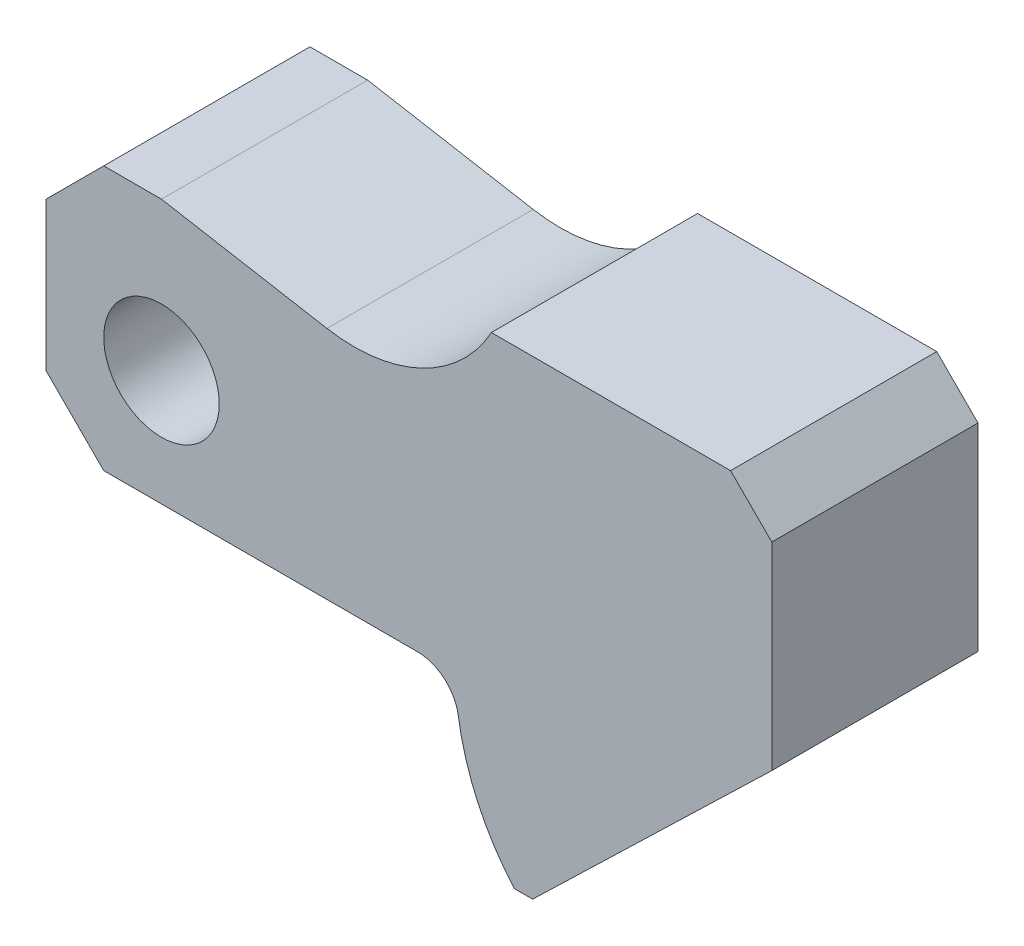
ISO-10303-21;
HEADER;
FILE_DESCRIPTION(('STEP AP214'),'2;1');
FILE_NAME('part.step','',(''),(''),'','','');
FILE_SCHEMA(('AUTOMOTIVE_DESIGN { 1 0 10303 214 1 1 1 1 }'));
ENDSEC;
DATA;
#1=APPLICATION_CONTEXT('core data for automotive mechanical design processes');
#2=APPLICATION_PROTOCOL_DEFINITION('international standard','automotive_design',2000,#1);
#3=PRODUCT_CONTEXT('',#1,'mechanical');
#4=PRODUCT('Part','Part','',(#3));
#5=PRODUCT_RELATED_PRODUCT_CATEGORY('part','',(#4));
#6=PRODUCT_DEFINITION_FORMATION('','',#4);
#7=PRODUCT_DEFINITION_CONTEXT('part definition',#1,'design');
#8=PRODUCT_DEFINITION('design','',#6,#7);
#9=PRODUCT_DEFINITION_SHAPE('','',#8);
#10=(LENGTH_UNIT() NAMED_UNIT(*) SI_UNIT(.MILLI.,.METRE.));
#11=(NAMED_UNIT(*) PLANE_ANGLE_UNIT() SI_UNIT($,.RADIAN.));
#12=(NAMED_UNIT(*) SI_UNIT($,.STERADIAN.) SOLID_ANGLE_UNIT());
#13=UNCERTAINTY_MEASURE_WITH_UNIT(LENGTH_MEASURE(1.E-05),#10,'distance_accuracy_value','');
#14=(GEOMETRIC_REPRESENTATION_CONTEXT(3) GLOBAL_UNCERTAINTY_ASSIGNED_CONTEXT((#13)) GLOBAL_UNIT_ASSIGNED_CONTEXT((#10,
#11,#12)) REPRESENTATION_CONTEXT('',''));
#15=CARTESIAN_POINT('',(0.,0.,0.));
#16=DIRECTION('',(0.,0.,1.));
#17=DIRECTION('',(1.,0.,0.));
#18=AXIS2_PLACEMENT_3D('',#15,#16,#17);
#19=CARTESIAN_POINT('',(0.,-10.,50.));
#20=DIRECTION('',(0.,0.,1.));
#21=DIRECTION('',(1.,0.,0.));
#22=AXIS2_PLACEMENT_3D('',#19,#20,#21);
#23=PLANE('',#22);
#24=CARTESIAN_POINT('',(0.,-10.,50.));
#25=DIRECTION('',(0.,0.,-1.));
#26=DIRECTION('',(1.,0.,0.));
#27=AXIS2_PLACEMENT_3D('',#24,#25,#26);
#28=CIRCLE('',#27,10.);
#29=CARTESIAN_POINT('',(0.,0.,50.));
#30=VERTEX_POINT('',#29);
#31=CARTESIAN_POINT('',(9.89127748282368,-8.52941176470592,50.));
#32=VERTEX_POINT('',#31);
#33=EDGE_CURVE('E199',#30,#32,#28,.T.);
#34=ORIENTED_EDGE('',*,*,#33,.T.);
#35=CARTESIAN_POINT('',(67.260686883201,0.,50.));
#36=DIRECTION('',(0.,0.,1.));
#37=DIRECTION('',(-1.,0.,0.));
#38=AXIS2_PLACEMENT_3D('',#35,#36,#37);
#39=CIRCLE('',#38,58.);
#40=CARTESIAN_POINT('',(23.4428822827877,-38.,50.));
#41=VERTEX_POINT('',#40);
#42=EDGE_CURVE('E117',#32,#41,#39,.T.);
#43=ORIENTED_EDGE('',*,*,#42,.T.);
#44=DIRECTION('',(1.,0.,0.));
#45=VECTOR('',#44,1.);
#46=CARTESIAN_POINT('',(27.9035440260581,-38.,50.));
#47=LINE('',#46,#45);
#48=CARTESIAN_POINT('',(27.9035440260581,-38.,50.));
#49=VERTEX_POINT('',#48);
#50=EDGE_CURVE('E232',#41,#49,#47,.T.);
#51=ORIENTED_EDGE('',*,*,#50,.T.);
#52=DIRECTION('',(0.719401460617409,0.694594513699567,0.));
#53=VECTOR('',#52,1.);
#54=CARTESIAN_POINT('',(85.9035440260581,18.,50.));
#55=LINE('',#54,#53);
#56=CARTESIAN_POINT('',(85.9035440260581,18.,50.));
#57=VERTEX_POINT('',#56);
#58=EDGE_CURVE('E251',#49,#57,#55,.T.);
#59=ORIENTED_EDGE('',*,*,#58,.T.);
#60=DIRECTION('',(0.,1.,0.));
#61=VECTOR('',#60,1.);
#62=CARTESIAN_POINT('',(85.9035440260581,66.,50.));
#63=LINE('',#62,#61);
#64=CARTESIAN_POINT('',(85.9035440260581,66.,50.));
#65=VERTEX_POINT('',#64);
#66=EDGE_CURVE('E248',#57,#65,#63,.T.);
#67=ORIENTED_EDGE('',*,*,#66,.T.);
#68=DIRECTION('',(-0.707106781186547,0.707106781186547,0.));
#69=VECTOR('',#68,1.);
#70=CARTESIAN_POINT('',(75.9035440260581,76.,50.));
#71=LINE('',#70,#69);
#72=CARTESIAN_POINT('',(75.9035440260581,76.,50.));
#73=VERTEX_POINT('',#72);
#74=EDGE_CURVE('E250',#65,#73,#71,.T.);
#75=ORIENTED_EDGE('',*,*,#74,.T.);
#76=DIRECTION('',(-1.,0.,0.));
#77=VECTOR('',#76,1.);
#78=CARTESIAN_POINT('',(17.9035440260581,76.,50.));
#79=LINE('',#78,#77);
#80=CARTESIAN_POINT('',(17.9035440260581,76.,50.));
#81=VERTEX_POINT('',#80);
#82=EDGE_CURVE('E253',#73,#81,#79,.T.);
#83=ORIENTED_EDGE('',*,*,#82,.T.);
#84=CARTESIAN_POINT('',(-15.3735066320414,94.3476946644064,50.));
#85=DIRECTION('',(0.,0.,-1.));
#86=DIRECTION('',(-1.,0.,0.));
#87=AXIS2_PLACEMENT_3D('',#84,#85,#86);
#88=CIRCLE('',#87,38.);
#89=CARTESIAN_POINT('',(-21.9721373833847,56.9250000499425,50.));
#90=VERTEX_POINT('',#89);
#91=EDGE_CURVE('E259',#81,#90,#88,.T.);
#92=ORIENTED_EDGE('',*,*,#91,.T.);
#93=DIRECTION('',(-0.984807753012208,0.173648177666931,0.));
#94=VECTOR('',#93,1.);
#95=CARTESIAN_POINT('',(-62.0964559739419,64.,50.));
#96=LINE('',#95,#94);
#97=CARTESIAN_POINT('',(-62.0964559739419,64.,50.));
#98=VERTEX_POINT('',#97);
#99=EDGE_CURVE('E261',#90,#98,#96,.T.);
#100=ORIENTED_EDGE('',*,*,#99,.T.);
#101=DIRECTION('',(-1.,0.,0.));
#102=VECTOR('',#101,1.);
#103=CARTESIAN_POINT('',(-76.0964559739419,64.,50.));
#104=LINE('',#103,#102);
#105=CARTESIAN_POINT('',(-76.0964559739419,64.,50.));
#106=VERTEX_POINT('',#105);
#107=EDGE_CURVE('E263',#98,#106,#104,.T.);
#108=ORIENTED_EDGE('',*,*,#107,.T.);
#109=DIRECTION('',(-0.707106781186549,-0.707106781186546,0.));
#110=VECTOR('',#109,1.);
#111=CARTESIAN_POINT('',(-90.0964559739419,50.,50.));
#112=LINE('',#111,#110);
#113=CARTESIAN_POINT('',(-90.0964559739419,50.,50.));
#114=VERTEX_POINT('',#113);
#115=EDGE_CURVE('E154',#106,#114,#112,.T.);
#116=ORIENTED_EDGE('',*,*,#115,.T.);
#117=DIRECTION('',(0.,-1.,0.));
#118=VECTOR('',#117,1.);
#119=CARTESIAN_POINT('',(-90.0964559739419,14.,50.));
#120=LINE('',#119,#118);
#121=CARTESIAN_POINT('',(-90.0964559739419,14.,50.));
#122=VERTEX_POINT('',#121);
#123=EDGE_CURVE('E148',#114,#122,#120,.T.);
#124=ORIENTED_EDGE('',*,*,#123,.T.);
#125=DIRECTION('',(0.707106781186549,-0.707106781186546,0.));
#126=VECTOR('',#125,1.);
#127=CARTESIAN_POINT('',(-76.0964559739419,0.,50.));
#128=LINE('',#127,#126);
#129=CARTESIAN_POINT('',(-76.0964559739419,0.,50.));
#130=VERTEX_POINT('',#129);
#131=EDGE_CURVE('E152',#122,#130,#128,.T.);
#132=ORIENTED_EDGE('',*,*,#131,.T.);
#133=DIRECTION('',(1.,0.,0.));
#134=VECTOR('',#133,1.);
#135=CARTESIAN_POINT('',(0.,0.,50.));
#136=LINE('',#135,#134);
#137=EDGE_CURVE('E56',#130,#30,#136,.T.);
#138=ORIENTED_EDGE('',*,*,#137,.T.);
#139=EDGE_LOOP('',(#34,#43,#51,#59,#67,#75,#83,#92,#100,#108,#116,#124,#132,#138));
#140=FACE_BOUND('',#139,.T.);
#141=CARTESIAN_POINT('',(-62.0964559739419,28.,50.));
#142=DIRECTION('',(0.,0.,1.));
#143=DIRECTION('',(1.,0.,0.));
#144=AXIS2_PLACEMENT_3D('',#141,#142,#143);
#145=CIRCLE('',#144,14.);
#146=CARTESIAN_POINT('',(-48.0964559739419,28.,50.));
#147=VERTEX_POINT('',#146);
#148=EDGE_CURVE('E176',#147,#147,#145,.T.);
#149=ORIENTED_EDGE('',*,*,#148,.F.);
#150=EDGE_LOOP('',(#149));
#151=FACE_BOUND('',#150,.T.);
#152=ADVANCED_FACE('F39',(#140,#151),#23,.T.);
#153=CARTESIAN_POINT('',(0.,-10.,0.));
#154=DIRECTION('',(0.,0.,1.));
#155=DIRECTION('',(1.,0.,0.));
#156=AXIS2_PLACEMENT_3D('',#153,#154,#155);
#157=PLANE('',#156);
#158=CARTESIAN_POINT('',(0.,-10.,0.));
#159=DIRECTION('',(0.,0.,-1.));
#160=DIRECTION('',(1.,0.,0.));
#161=AXIS2_PLACEMENT_3D('',#158,#159,#160);
#162=CIRCLE('',#161,10.);
#163=CARTESIAN_POINT('',(0.,0.,0.));
#164=VERTEX_POINT('',#163);
#165=CARTESIAN_POINT('',(9.89127748282368,-8.52941176470592,0.));
#166=VERTEX_POINT('',#165);
#167=EDGE_CURVE('E172',#164,#166,#162,.T.);
#168=ORIENTED_EDGE('',*,*,#167,.F.);
#169=DIRECTION('',(1.,0.,0.));
#170=VECTOR('',#169,1.);
#171=CARTESIAN_POINT('',(0.,0.,0.));
#172=LINE('',#171,#170);
#173=CARTESIAN_POINT('',(-76.0964559739419,0.,0.));
#174=VERTEX_POINT('',#173);
#175=EDGE_CURVE('E109',#174,#164,#172,.T.);
#176=ORIENTED_EDGE('',*,*,#175,.F.);
#177=DIRECTION('',(0.707106781186549,-0.707106781186546,0.));
#178=VECTOR('',#177,1.);
#179=CARTESIAN_POINT('',(-76.0964559739419,0.,0.));
#180=LINE('',#179,#178);
#181=CARTESIAN_POINT('',(-90.0964559739419,14.,0.));
#182=VERTEX_POINT('',#181);
#183=EDGE_CURVE('E103',#182,#174,#180,.T.);
#184=ORIENTED_EDGE('',*,*,#183,.F.);
#185=DIRECTION('',(0.,-1.,0.));
#186=VECTOR('',#185,1.);
#187=CARTESIAN_POINT('',(-90.0964559739419,14.,0.));
#188=LINE('',#187,#186);
#189=CARTESIAN_POINT('',(-90.0964559739419,50.,0.));
#190=VERTEX_POINT('',#189);
#191=EDGE_CURVE('E162',#190,#182,#188,.T.);
#192=ORIENTED_EDGE('',*,*,#191,.F.);
#193=DIRECTION('',(-0.707106781186549,-0.707106781186546,0.));
#194=VECTOR('',#193,1.);
#195=CARTESIAN_POINT('',(-90.0964559739419,50.,0.));
#196=LINE('',#195,#194);
#197=CARTESIAN_POINT('',(-76.0964559739419,64.,0.));
#198=VERTEX_POINT('',#197);
#199=EDGE_CURVE('E194',#198,#190,#196,.T.);
#200=ORIENTED_EDGE('',*,*,#199,.F.);
#201=DIRECTION('',(-1.,0.,0.));
#202=VECTOR('',#201,1.);
#203=CARTESIAN_POINT('',(-76.0964559739419,64.,0.));
#204=LINE('',#203,#202);
#205=CARTESIAN_POINT('',(-62.0964559739419,64.,0.));
#206=VERTEX_POINT('',#205);
#207=EDGE_CURVE('E192',#206,#198,#204,.T.);
#208=ORIENTED_EDGE('',*,*,#207,.F.);
#209=DIRECTION('',(-0.984807753012208,0.173648177666931,0.));
#210=VECTOR('',#209,1.);
#211=CARTESIAN_POINT('',(-62.0964559739419,64.,0.));
#212=LINE('',#211,#210);
#213=CARTESIAN_POINT('',(-21.9721373833847,56.9250000499425,0.));
#214=VERTEX_POINT('',#213);
#215=EDGE_CURVE('E190',#214,#206,#212,.T.);
#216=ORIENTED_EDGE('',*,*,#215,.F.);
#217=CARTESIAN_POINT('',(-15.3735066320414,94.3476946644064,0.));
#218=DIRECTION('',(0.,0.,-1.));
#219=DIRECTION('',(-1.,0.,0.));
#220=AXIS2_PLACEMENT_3D('',#217,#218,#219);
#221=CIRCLE('',#220,38.);
#222=CARTESIAN_POINT('',(17.9035440260581,76.,0.));
#223=VERTEX_POINT('',#222);
#224=EDGE_CURVE('E188',#223,#214,#221,.T.);
#225=ORIENTED_EDGE('',*,*,#224,.F.);
#226=DIRECTION('',(-1.,0.,0.));
#227=VECTOR('',#226,1.);
#228=CARTESIAN_POINT('',(17.9035440260581,76.,0.));
#229=LINE('',#228,#227);
#230=CARTESIAN_POINT('',(75.9035440260581,76.,0.));
#231=VERTEX_POINT('',#230);
#232=EDGE_CURVE('E186',#231,#223,#229,.T.);
#233=ORIENTED_EDGE('',*,*,#232,.F.);
#234=DIRECTION('',(-0.707106781186547,0.707106781186547,0.));
#235=VECTOR('',#234,1.);
#236=CARTESIAN_POINT('',(75.9035440260581,76.,0.));
#237=LINE('',#236,#235);
#238=CARTESIAN_POINT('',(85.9035440260581,66.,0.));
#239=VERTEX_POINT('',#238);
#240=EDGE_CURVE('E184',#239,#231,#237,.T.);
#241=ORIENTED_EDGE('',*,*,#240,.F.);
#242=DIRECTION('',(0.,1.,0.));
#243=VECTOR('',#242,1.);
#244=CARTESIAN_POINT('',(85.9035440260581,66.,0.));
#245=LINE('',#244,#243);
#246=CARTESIAN_POINT('',(85.9035440260581,18.,0.));
#247=VERTEX_POINT('',#246);
#248=EDGE_CURVE('E182',#247,#239,#245,.T.);
#249=ORIENTED_EDGE('',*,*,#248,.F.);
#250=DIRECTION('',(0.719401460617409,0.694594513699567,0.));
#251=VECTOR('',#250,1.);
#252=CARTESIAN_POINT('',(85.9035440260581,18.,0.));
#253=LINE('',#252,#251);
#254=CARTESIAN_POINT('',(27.9035440260581,-38.,0.));
#255=VERTEX_POINT('',#254);
#256=EDGE_CURVE('E180',#255,#247,#253,.T.);
#257=ORIENTED_EDGE('',*,*,#256,.F.);
#258=DIRECTION('',(1.,0.,0.));
#259=VECTOR('',#258,1.);
#260=CARTESIAN_POINT('',(27.9035440260581,-38.,0.));
#261=LINE('',#260,#259);
#262=CARTESIAN_POINT('',(23.4428822827877,-38.,0.));
#263=VERTEX_POINT('',#262);
#264=EDGE_CURVE('E178',#263,#255,#261,.T.);
#265=ORIENTED_EDGE('',*,*,#264,.F.);
#266=CARTESIAN_POINT('',(67.260686883201,0.,0.));
#267=DIRECTION('',(0.,0.,1.));
#268=DIRECTION('',(-1.,0.,0.));
#269=AXIS2_PLACEMENT_3D('',#266,#267,#268);
#270=CIRCLE('',#269,58.);
#271=EDGE_CURVE('E175',#166,#263,#270,.T.);
#272=ORIENTED_EDGE('',*,*,#271,.F.);
#273=EDGE_LOOP('',(#168,#176,#184,#192,#200,#208,#216,#225,#233,#241,#249,#257,#265,#272));
#274=FACE_BOUND('',#273,.T.);
#275=CARTESIAN_POINT('',(-62.0964559739419,28.,0.));
#276=DIRECTION('',(0.,0.,1.));
#277=DIRECTION('',(1.,0.,0.));
#278=AXIS2_PLACEMENT_3D('',#275,#276,#277);
#279=CIRCLE('',#278,14.);
#280=CARTESIAN_POINT('',(-48.0964559739419,28.,0.));
#281=VERTEX_POINT('',#280);
#282=EDGE_CURVE('E436',#281,#281,#279,.T.);
#283=ORIENTED_EDGE('',*,*,#282,.T.);
#284=EDGE_LOOP('',(#283));
#285=FACE_BOUND('',#284,.T.);
#286=ADVANCED_FACE('F236',(#274,#285),#157,.F.);
#287=CARTESIAN_POINT('',(0.,-10.,50.));
#288=DIRECTION('',(0.,0.,-1.));
#289=DIRECTION('',(-1.,0.,0.));
#290=AXIS2_PLACEMENT_3D('',#287,#288,#289);
#291=CYLINDRICAL_SURFACE('',#290,10.);
#292=ORIENTED_EDGE('',*,*,#167,.T.);
#293=DIRECTION('',(0.,0.,-1.));
#294=VECTOR('',#293,1.);
#295=CARTESIAN_POINT('',(9.89127748282368,-8.52941176470592,50.));
#296=LINE('',#295,#294);
#297=EDGE_CURVE('E11',#32,#166,#296,.T.);
#298=ORIENTED_EDGE('',*,*,#297,.F.);
#299=ORIENTED_EDGE('',*,*,#33,.F.);
#300=DIRECTION('',(0.,0.,-1.));
#301=VECTOR('',#300,1.);
#302=CARTESIAN_POINT('',(0.,0.,50.));
#303=LINE('',#302,#301);
#304=EDGE_CURVE('E168',#30,#164,#303,.T.);
#305=ORIENTED_EDGE('',*,*,#304,.T.);
#306=EDGE_LOOP('',(#292,#298,#299,#305));
#307=FACE_BOUND('',#306,.T.);
#308=ADVANCED_FACE('F41',(#307),#291,.F.);
#309=CARTESIAN_POINT('',(67.260686883201,0.,50.));
#310=DIRECTION('',(0.,0.,-1.));
#311=DIRECTION('',(-1.,0.,0.));
#312=AXIS2_PLACEMENT_3D('',#309,#310,#311);
#313=CYLINDRICAL_SURFACE('',#312,58.);
#314=ORIENTED_EDGE('',*,*,#271,.T.);
#315=DIRECTION('',(0.,0.,-1.));
#316=VECTOR('',#315,1.);
#317=CARTESIAN_POINT('',(23.4428822827877,-38.,50.));
#318=LINE('',#317,#316);
#319=EDGE_CURVE('E48',#41,#263,#318,.T.);
#320=ORIENTED_EDGE('',*,*,#319,.F.);
#321=ORIENTED_EDGE('',*,*,#42,.F.);
#322=ORIENTED_EDGE('',*,*,#297,.T.);
#323=EDGE_LOOP('',(#314,#320,#321,#322));
#324=FACE_BOUND('',#323,.T.);
#325=ADVANCED_FACE('F297',(#324),#313,.T.);
#326=CARTESIAN_POINT('',(27.9035440260581,-38.,50.));
#327=DIRECTION('',(0.,1.,0.));
#328=DIRECTION('',(0.,0.,1.));
#329=AXIS2_PLACEMENT_3D('',#326,#327,#328);
#330=PLANE('',#329);
#331=ORIENTED_EDGE('',*,*,#264,.T.);
#332=DIRECTION('',(0.,0.,-1.));
#333=VECTOR('',#332,1.);
#334=CARTESIAN_POINT('',(27.9035440260581,-38.,50.));
#335=LINE('',#334,#333);
#336=EDGE_CURVE('E224',#49,#255,#335,.T.);
#337=ORIENTED_EDGE('',*,*,#336,.F.);
#338=ORIENTED_EDGE('',*,*,#50,.F.);
#339=ORIENTED_EDGE('',*,*,#319,.T.);
#340=EDGE_LOOP('',(#331,#337,#338,#339));
#341=FACE_BOUND('',#340,.T.);
#342=ADVANCED_FACE('F230',(#341),#330,.F.);
#343=CARTESIAN_POINT('',(85.9035440260581,18.,50.));
#344=DIRECTION('',(-0.694594513699567,0.719401460617409,0.));
#345=DIRECTION('',(-0.719401460617409,-0.694594513699567,0.));
#346=AXIS2_PLACEMENT_3D('',#343,#344,#345);
#347=PLANE('',#346);
#348=ORIENTED_EDGE('',*,*,#256,.T.);
#349=DIRECTION('',(0.,0.,-1.));
#350=VECTOR('',#349,1.);
#351=CARTESIAN_POINT('',(85.9035440260581,18.,50.));
#352=LINE('',#351,#350);
#353=EDGE_CURVE('E221',#57,#247,#352,.T.);
#354=ORIENTED_EDGE('',*,*,#353,.F.);
#355=ORIENTED_EDGE('',*,*,#58,.F.);
#356=ORIENTED_EDGE('',*,*,#336,.T.);
#357=EDGE_LOOP('',(#348,#354,#355,#356));
#358=FACE_BOUND('',#357,.T.);
#359=ADVANCED_FACE('F242',(#358),#347,.F.);
#360=CARTESIAN_POINT('',(85.9035440260581,66.,50.));
#361=DIRECTION('',(-1.,0.,0.));
#362=DIRECTION('',(0.,-1.,0.));
#363=AXIS2_PLACEMENT_3D('',#360,#361,#362);
#364=PLANE('',#363);
#365=ORIENTED_EDGE('',*,*,#248,.T.);
#366=DIRECTION('',(0.,0.,-1.));
#367=VECTOR('',#366,1.);
#368=CARTESIAN_POINT('',(85.9035440260581,66.,50.));
#369=LINE('',#368,#367);
#370=EDGE_CURVE('E218',#65,#239,#369,.T.);
#371=ORIENTED_EDGE('',*,*,#370,.F.);
#372=ORIENTED_EDGE('',*,*,#66,.F.);
#373=ORIENTED_EDGE('',*,*,#353,.T.);
#374=EDGE_LOOP('',(#365,#371,#372,#373));
#375=FACE_BOUND('',#374,.T.);
#376=ADVANCED_FACE('F246',(#375),#364,.F.);
#377=CARTESIAN_POINT('',(75.9035440260581,76.,50.));
#378=DIRECTION('',(-0.707106781186547,-0.707106781186547,0.));
#379=DIRECTION('',(0.707106781186548,-0.707106781186548,0.));
#380=AXIS2_PLACEMENT_3D('',#377,#378,#379);
#381=PLANE('',#380);
#382=ORIENTED_EDGE('',*,*,#240,.T.);
#383=DIRECTION('',(0.,0.,-1.));
#384=VECTOR('',#383,1.);
#385=CARTESIAN_POINT('',(75.9035440260581,76.,50.));
#386=LINE('',#385,#384);
#387=EDGE_CURVE('E215',#73,#231,#386,.T.);
#388=ORIENTED_EDGE('',*,*,#387,.F.);
#389=ORIENTED_EDGE('',*,*,#74,.F.);
#390=ORIENTED_EDGE('',*,*,#370,.T.);
#391=EDGE_LOOP('',(#382,#388,#389,#390));
#392=FACE_BOUND('',#391,.T.);
#393=ADVANCED_FACE('F310',(#392),#381,.F.);
#394=CARTESIAN_POINT('',(17.9035440260581,76.,50.));
#395=DIRECTION('',(0.,-1.,0.));
#396=DIRECTION('',(0.,0.,-1.));
#397=AXIS2_PLACEMENT_3D('',#394,#395,#396);
#398=PLANE('',#397);
#399=ORIENTED_EDGE('',*,*,#232,.T.);
#400=DIRECTION('',(0.,0.,-1.));
#401=VECTOR('',#400,1.);
#402=CARTESIAN_POINT('',(17.9035440260581,76.,50.));
#403=LINE('',#402,#401);
#404=EDGE_CURVE('E212',#81,#223,#403,.T.);
#405=ORIENTED_EDGE('',*,*,#404,.F.);
#406=ORIENTED_EDGE('',*,*,#82,.F.);
#407=ORIENTED_EDGE('',*,*,#387,.T.);
#408=EDGE_LOOP('',(#399,#405,#406,#407));
#409=FACE_BOUND('',#408,.T.);
#410=ADVANCED_FACE('F313',(#409),#398,.F.);
#411=CARTESIAN_POINT('',(-15.3735066320414,94.3476946644064,50.));
#412=DIRECTION('',(0.,0.,-1.));
#413=DIRECTION('',(-1.,0.,0.));
#414=AXIS2_PLACEMENT_3D('',#411,#412,#413);
#415=CYLINDRICAL_SURFACE('',#414,38.);
#416=ORIENTED_EDGE('',*,*,#224,.T.);
#417=DIRECTION('',(0.,0.,-1.));
#418=VECTOR('',#417,1.);
#419=CARTESIAN_POINT('',(-21.9721373833847,56.9250000499425,50.));
#420=LINE('',#419,#418);
#421=EDGE_CURVE('E209',#90,#214,#420,.T.);
#422=ORIENTED_EDGE('',*,*,#421,.F.);
#423=ORIENTED_EDGE('',*,*,#91,.F.);
#424=ORIENTED_EDGE('',*,*,#404,.T.);
#425=EDGE_LOOP('',(#416,#422,#423,#424));
#426=FACE_BOUND('',#425,.T.);
#427=ADVANCED_FACE('F317',(#426),#415,.F.);
#428=CARTESIAN_POINT('',(-62.0964559739419,64.,50.));
#429=DIRECTION('',(-0.173648177666931,-0.984807753012208,0.));
#430=DIRECTION('',(0.984807753012208,-0.173648177666931,0.));
#431=AXIS2_PLACEMENT_3D('',#428,#429,#430);
#432=PLANE('',#431);
#433=ORIENTED_EDGE('',*,*,#215,.T.);
#434=DIRECTION('',(0.,0.,-1.));
#435=VECTOR('',#434,1.);
#436=CARTESIAN_POINT('',(-62.0964559739419,64.,50.));
#437=LINE('',#436,#435);
#438=EDGE_CURVE('E206',#98,#206,#437,.T.);
#439=ORIENTED_EDGE('',*,*,#438,.F.);
#440=ORIENTED_EDGE('',*,*,#99,.F.);
#441=ORIENTED_EDGE('',*,*,#421,.T.);
#442=EDGE_LOOP('',(#433,#439,#440,#441));
#443=FACE_BOUND('',#442,.T.);
#444=ADVANCED_FACE('F321',(#443),#432,.F.);
#445=CARTESIAN_POINT('',(-76.0964559739419,64.,50.));
#446=DIRECTION('',(0.,-1.,0.));
#447=DIRECTION('',(1.,0.,0.));
#448=AXIS2_PLACEMENT_3D('',#445,#446,#447);
#449=PLANE('',#448);
#450=ORIENTED_EDGE('',*,*,#207,.T.);
#451=DIRECTION('',(0.,0.,-1.));
#452=VECTOR('',#451,1.);
#453=CARTESIAN_POINT('',(-76.0964559739419,64.,50.));
#454=LINE('',#453,#452);
#455=EDGE_CURVE('E203',#106,#198,#454,.T.);
#456=ORIENTED_EDGE('',*,*,#455,.F.);
#457=ORIENTED_EDGE('',*,*,#107,.F.);
#458=ORIENTED_EDGE('',*,*,#438,.T.);
#459=EDGE_LOOP('',(#450,#456,#457,#458));
#460=FACE_BOUND('',#459,.T.);
#461=ADVANCED_FACE('F269',(#460),#449,.F.);
#462=CARTESIAN_POINT('',(-90.0964559739419,50.,50.));
#463=DIRECTION('',(0.707106781186546,-0.707106781186549,0.));
#464=DIRECTION('',(0.707106781186549,0.707106781186546,0.));
#465=AXIS2_PLACEMENT_3D('',#462,#463,#464);
#466=PLANE('',#465);
#467=ORIENTED_EDGE('',*,*,#199,.T.);
#468=DIRECTION('',(0.,0.,-1.));
#469=VECTOR('',#468,1.);
#470=CARTESIAN_POINT('',(-90.0964559739419,50.,50.));
#471=LINE('',#470,#469);
#472=EDGE_CURVE('E163',#114,#190,#471,.T.);
#473=ORIENTED_EDGE('',*,*,#472,.F.);
#474=ORIENTED_EDGE('',*,*,#115,.F.);
#475=ORIENTED_EDGE('',*,*,#455,.T.);
#476=EDGE_LOOP('',(#467,#473,#474,#475));
#477=FACE_BOUND('',#476,.T.);
#478=ADVANCED_FACE('F273',(#477),#466,.F.);
#479=CARTESIAN_POINT('',(-90.0964559739419,14.,50.));
#480=DIRECTION('',(1.,0.,0.));
#481=DIRECTION('',(0.,0.,-1.));
#482=AXIS2_PLACEMENT_3D('',#479,#480,#481);
#483=PLANE('',#482);
#484=ORIENTED_EDGE('',*,*,#191,.T.);
#485=DIRECTION('',(0.,0.,-1.));
#486=VECTOR('',#485,1.);
#487=CARTESIAN_POINT('',(-90.0964559739419,14.,50.));
#488=LINE('',#487,#486);
#489=EDGE_CURVE('E159',#122,#182,#488,.T.);
#490=ORIENTED_EDGE('',*,*,#489,.F.);
#491=ORIENTED_EDGE('',*,*,#123,.F.);
#492=ORIENTED_EDGE('',*,*,#472,.T.);
#493=EDGE_LOOP('',(#484,#490,#491,#492));
#494=FACE_BOUND('',#493,.T.);
#495=ADVANCED_FACE('F160',(#494),#483,.F.);
#496=CARTESIAN_POINT('',(-76.0964559739419,0.,50.));
#497=DIRECTION('',(0.707106781186546,0.707106781186549,0.));
#498=DIRECTION('',(-0.707106781186549,0.707106781186546,0.));
#499=AXIS2_PLACEMENT_3D('',#496,#497,#498);
#500=PLANE('',#499);
#501=ORIENTED_EDGE('',*,*,#183,.T.);
#502=DIRECTION('',(0.,0.,-1.));
#503=VECTOR('',#502,1.);
#504=CARTESIAN_POINT('',(-76.0964559739419,0.,50.));
#505=LINE('',#504,#503);
#506=EDGE_CURVE('E164',#130,#174,#505,.T.);
#507=ORIENTED_EDGE('',*,*,#506,.F.);
#508=ORIENTED_EDGE('',*,*,#131,.F.);
#509=ORIENTED_EDGE('',*,*,#489,.T.);
#510=EDGE_LOOP('',(#501,#507,#508,#509));
#511=FACE_BOUND('',#510,.T.);
#512=ADVANCED_FACE('F166',(#511),#500,.F.);
#513=CARTESIAN_POINT('',(0.,0.,50.));
#514=DIRECTION('',(0.,1.,0.));
#515=DIRECTION('',(-1.,0.,0.));
#516=AXIS2_PLACEMENT_3D('',#513,#514,#515);
#517=PLANE('',#516);
#518=ORIENTED_EDGE('',*,*,#175,.T.);
#519=ORIENTED_EDGE('',*,*,#304,.F.);
#520=ORIENTED_EDGE('',*,*,#137,.F.);
#521=ORIENTED_EDGE('',*,*,#506,.T.);
#522=EDGE_LOOP('',(#518,#519,#520,#521));
#523=FACE_BOUND('',#522,.T.);
#524=ADVANCED_FACE('F277',(#523),#517,.F.);
#525=CARTESIAN_POINT('',(-62.0964559739419,28.,50.));
#526=DIRECTION('',(0.,0.,-1.));
#527=DIRECTION('',(-1.,0.,0.));
#528=AXIS2_PLACEMENT_3D('',#525,#526,#527);
#529=CYLINDRICAL_SURFACE('',#528,14.);
#530=ORIENTED_EDGE('',*,*,#148,.T.);
#531=EDGE_LOOP('',(#530));
#532=FACE_BOUND('',#531,.T.);
#533=ORIENTED_EDGE('',*,*,#282,.F.);
#534=EDGE_LOOP('',(#533));
#535=FACE_BOUND('',#534,.T.);
#536=ADVANCED_FACE('F279',(#532,#535),#529,.F.);
#537=CLOSED_SHELL('',(#152,#286,#308,#325,#342,#359,#376,#393,#410,#427,#444,#461,#478,#495,
#512,#524,#536));
#538=MANIFOLD_SOLID_BREP('B2',#537);
#539=ADVANCED_BREP_SHAPE_REPRESENTATION('',(#18,#538),#14);
#540=SHAPE_DEFINITION_REPRESENTATION(#9,#539);
ENDSEC;
END-ISO-10303-21;
